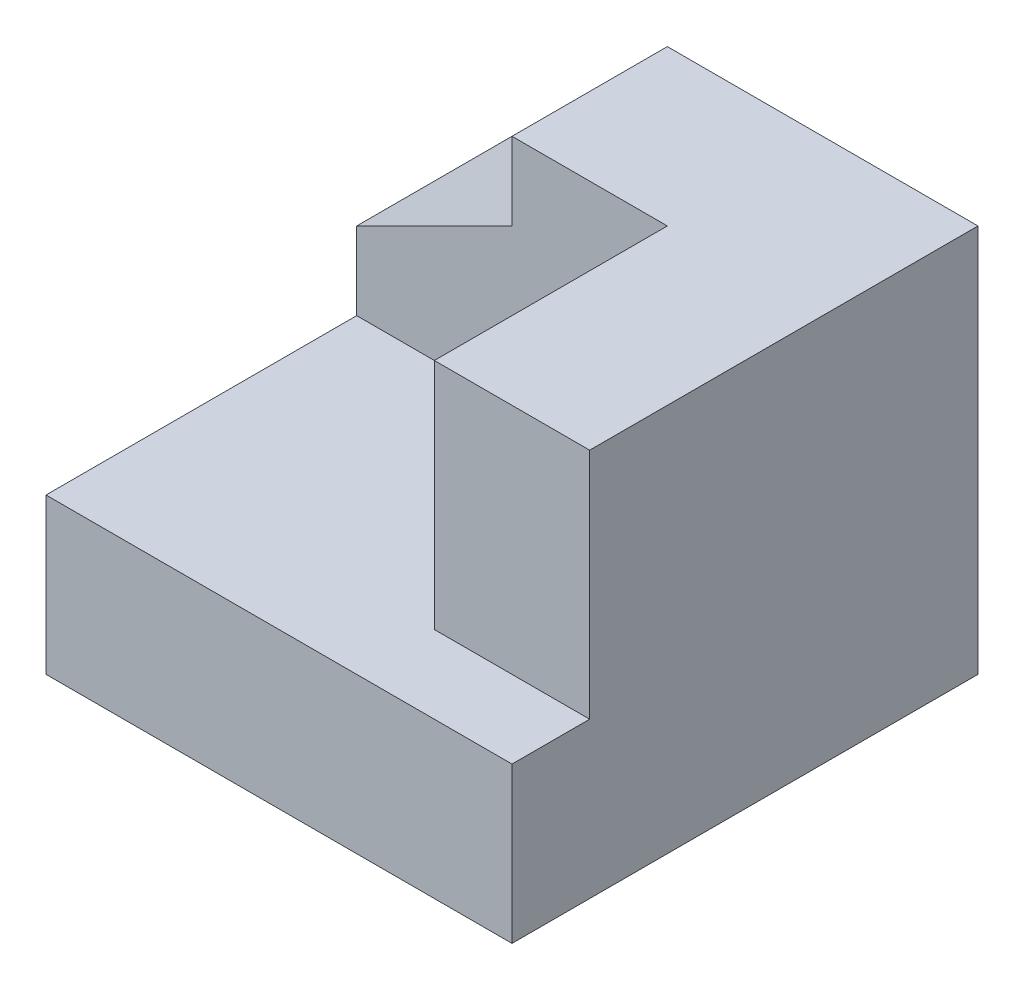
ISO-10303-21;
HEADER;
FILE_DESCRIPTION(('STEP AP214'),'2;1');
FILE_NAME('part.step','',(''),(''),'','','');
FILE_SCHEMA(('AUTOMOTIVE_DESIGN { 1 0 10303 214 1 1 1 1 }'));
ENDSEC;
DATA;
#1=APPLICATION_CONTEXT('core data for automotive mechanical design processes');
#2=APPLICATION_PROTOCOL_DEFINITION('international standard','automotive_design',2000,#1);
#3=PRODUCT_CONTEXT('',#1,'mechanical');
#4=PRODUCT('Part','Part','',(#3));
#5=PRODUCT_RELATED_PRODUCT_CATEGORY('part','',(#4));
#6=PRODUCT_DEFINITION_FORMATION('','',#4);
#7=PRODUCT_DEFINITION_CONTEXT('part definition',#1,'design');
#8=PRODUCT_DEFINITION('design','',#6,#7);
#9=PRODUCT_DEFINITION_SHAPE('','',#8);
#10=(LENGTH_UNIT() NAMED_UNIT(*) SI_UNIT(.MILLI.,.METRE.));
#11=(NAMED_UNIT(*) PLANE_ANGLE_UNIT() SI_UNIT($,.RADIAN.));
#12=(NAMED_UNIT(*) SI_UNIT($,.STERADIAN.) SOLID_ANGLE_UNIT());
#13=UNCERTAINTY_MEASURE_WITH_UNIT(LENGTH_MEASURE(1.E-05),#10,'distance_accuracy_value','');
#14=(GEOMETRIC_REPRESENTATION_CONTEXT(3) GLOBAL_UNCERTAINTY_ASSIGNED_CONTEXT((#13)) GLOBAL_UNIT_ASSIGNED_CONTEXT((#10,
#11,#12)) REPRESENTATION_CONTEXT('',''));
#15=CARTESIAN_POINT('',(0.,0.,0.));
#16=DIRECTION('',(0.,0.,1.));
#17=DIRECTION('',(1.,0.,0.));
#18=AXIS2_PLACEMENT_3D('',#15,#16,#17);
#19=CARTESIAN_POINT('',(0.,-100.,120.));
#20=DIRECTION('',(0.,1.,0.));
#21=DIRECTION('',(0.,0.,1.));
#22=AXIS2_PLACEMENT_3D('',#19,#20,#21);
#23=PLANE('',#22);
#24=DIRECTION('',(0.,0.,-1.));
#25=VECTOR('',#24,1.);
#26=CARTESIAN_POINT('',(-120.,-100.,120.));
#27=LINE('',#26,#25);
#28=CARTESIAN_POINT('',(-120.,-100.,120.));
#29=VERTEX_POINT('',#28);
#30=CARTESIAN_POINT('',(-120.,-100.,-120.));
#31=VERTEX_POINT('',#30);
#32=EDGE_CURVE('E205',#29,#31,#27,.T.);
#33=ORIENTED_EDGE('',*,*,#32,.T.);
#34=DIRECTION('',(1.,0.,0.));
#35=VECTOR('',#34,1.);
#36=CARTESIAN_POINT('',(0.,-100.,-120.));
#37=LINE('',#36,#35);
#38=CARTESIAN_POINT('',(120.,-100.,-120.));
#39=VERTEX_POINT('',#38);
#40=EDGE_CURVE('E141',#31,#39,#37,.T.);
#41=ORIENTED_EDGE('',*,*,#40,.T.);
#42=DIRECTION('',(0.,0.,-1.));
#43=VECTOR('',#42,1.);
#44=CARTESIAN_POINT('',(120.,-100.,120.));
#45=LINE('',#44,#43);
#46=CARTESIAN_POINT('',(120.,-100.,120.));
#47=VERTEX_POINT('',#46);
#48=EDGE_CURVE('E11',#47,#39,#45,.T.);
#49=ORIENTED_EDGE('',*,*,#48,.F.);
#50=DIRECTION('',(1.,0.,0.));
#51=VECTOR('',#50,1.);
#52=CARTESIAN_POINT('',(0.,-100.,120.));
#53=LINE('',#52,#51);
#54=EDGE_CURVE('E187',#29,#47,#53,.T.);
#55=ORIENTED_EDGE('',*,*,#54,.F.);
#56=EDGE_LOOP('',(#33,#41,#49,#55));
#57=FACE_BOUND('',#56,.T.);
#58=ADVANCED_FACE('F34',(#57),#23,.F.);
#59=CARTESIAN_POINT('',(120.,0.,120.));
#60=DIRECTION('',(-1.,0.,0.));
#61=DIRECTION('',(0.,0.,1.));
#62=AXIS2_PLACEMENT_3D('',#59,#60,#61);
#63=PLANE('',#62);
#64=ORIENTED_EDGE('',*,*,#48,.T.);
#65=DIRECTION('',(0.,1.,0.));
#66=VECTOR('',#65,1.);
#67=CARTESIAN_POINT('',(120.,0.,-120.));
#68=LINE('',#67,#66);
#69=CARTESIAN_POINT('',(120.,100.,-120.));
#70=VERTEX_POINT('',#69);
#71=EDGE_CURVE('E144',#39,#70,#68,.T.);
#72=ORIENTED_EDGE('',*,*,#71,.T.);
#73=DIRECTION('',(0.,0.,-1.));
#74=VECTOR('',#73,1.);
#75=CARTESIAN_POINT('',(120.,100.,80.));
#76=LINE('',#75,#74);
#77=CARTESIAN_POINT('',(120.,100.,80.));
#78=VERTEX_POINT('',#77);
#79=EDGE_CURVE('E155',#78,#70,#76,.T.);
#80=ORIENTED_EDGE('',*,*,#79,.F.);
#81=DIRECTION('',(0.,1.,0.));
#82=VECTOR('',#81,1.);
#83=CARTESIAN_POINT('',(120.,0.,80.));
#84=LINE('',#83,#82);
#85=CARTESIAN_POINT('',(120.,-20.,80.));
#86=VERTEX_POINT('',#85);
#87=EDGE_CURVE('E158',#86,#78,#84,.T.);
#88=ORIENTED_EDGE('',*,*,#87,.F.);
#89=DIRECTION('',(0.,0.,-1.));
#90=VECTOR('',#89,1.);
#91=CARTESIAN_POINT('',(120.,-20.,120.));
#92=LINE('',#91,#90);
#93=CARTESIAN_POINT('',(120.,-20.,120.));
#94=VERTEX_POINT('',#93);
#95=EDGE_CURVE('E42',#94,#86,#92,.T.);
#96=ORIENTED_EDGE('',*,*,#95,.F.);
#97=DIRECTION('',(0.,1.,0.));
#98=VECTOR('',#97,1.);
#99=CARTESIAN_POINT('',(120.,0.,120.));
#100=LINE('',#99,#98);
#101=EDGE_CURVE('E214',#47,#94,#100,.T.);
#102=ORIENTED_EDGE('',*,*,#101,.F.);
#103=EDGE_LOOP('',(#64,#72,#80,#88,#96,#102));
#104=FACE_BOUND('',#103,.T.);
#105=ADVANCED_FACE('F223',(#104),#63,.F.);
#106=CARTESIAN_POINT('',(0.,-20.,120.));
#107=DIRECTION('',(0.,-1.,0.));
#108=DIRECTION('',(1.,0.,0.));
#109=AXIS2_PLACEMENT_3D('',#106,#107,#108);
#110=PLANE('',#109);
#111=DIRECTION('',(0.,0.,-1.));
#112=VECTOR('',#111,1.);
#113=CARTESIAN_POINT('',(40.,-20.,80.));
#114=LINE('',#113,#112);
#115=CARTESIAN_POINT('',(40.,-20.,80.));
#116=VERTEX_POINT('',#115);
#117=CARTESIAN_POINT('',(40.,-20.,-40.));
#118=VERTEX_POINT('',#117);
#119=EDGE_CURVE('E157',#116,#118,#114,.T.);
#120=ORIENTED_EDGE('',*,*,#119,.T.);
#121=DIRECTION('',(1.,0.,0.));
#122=VECTOR('',#121,1.);
#123=CARTESIAN_POINT('',(-120.,-20.,-40.));
#124=LINE('',#123,#122);
#125=CARTESIAN_POINT('',(-120.,-20.,-40.));
#126=VERTEX_POINT('',#125);
#127=EDGE_CURVE('E130',#126,#118,#124,.T.);
#128=ORIENTED_EDGE('',*,*,#127,.F.);
#129=DIRECTION('',(0.,0.,-1.));
#130=VECTOR('',#129,1.);
#131=CARTESIAN_POINT('',(-120.,-20.,120.));
#132=LINE('',#131,#130);
#133=CARTESIAN_POINT('',(-120.,-20.,120.));
#134=VERTEX_POINT('',#133);
#135=EDGE_CURVE('E129',#134,#126,#132,.T.);
#136=ORIENTED_EDGE('',*,*,#135,.F.);
#137=DIRECTION('',(-1.,0.,0.));
#138=VECTOR('',#137,1.);
#139=CARTESIAN_POINT('',(0.,-20.,120.));
#140=LINE('',#139,#138);
#141=EDGE_CURVE('E216',#94,#134,#140,.T.);
#142=ORIENTED_EDGE('',*,*,#141,.F.);
#143=ORIENTED_EDGE('',*,*,#95,.T.);
#144=DIRECTION('',(-1.,0.,0.));
#145=VECTOR('',#144,1.);
#146=CARTESIAN_POINT('',(0.,-20.,80.));
#147=LINE('',#146,#145);
#148=EDGE_CURVE('E154',#86,#116,#147,.T.);
#149=ORIENTED_EDGE('',*,*,#148,.T.);
#150=EDGE_LOOP('',(#120,#128,#136,#142,#143,#149));
#151=FACE_BOUND('',#150,.T.);
#152=ADVANCED_FACE('F174',(#151),#110,.F.);
#153=CARTESIAN_POINT('',(-120.,0.,120.));
#154=DIRECTION('',(-1.,0.,0.));
#155=DIRECTION('',(0.,0.,1.));
#156=AXIS2_PLACEMENT_3D('',#153,#154,#155);
#157=PLANE('',#156);
#158=DIRECTION('',(0.,0.,-1.));
#159=VECTOR('',#158,1.);
#160=CARTESIAN_POINT('',(-120.,19.9999999999999,120.000025));
#161=LINE('',#160,#159);
#162=CARTESIAN_POINT('',(-120.,19.9999999999999,-39.9999999999999));
#163=VERTEX_POINT('',#162);
#164=CARTESIAN_POINT('',(-120.,19.9999999999999,-120.));
#165=VERTEX_POINT('',#164);
#166=EDGE_CURVE('E110',#163,#165,#161,.T.);
#167=ORIENTED_EDGE('',*,*,#166,.T.);
#168=DIRECTION('',(0.,1.,0.));
#169=VECTOR('',#168,1.);
#170=CARTESIAN_POINT('',(-120.,0.,-120.));
#171=LINE('',#170,#169);
#172=EDGE_CURVE('E147',#31,#165,#171,.T.);
#173=ORIENTED_EDGE('',*,*,#172,.F.);
#174=ORIENTED_EDGE('',*,*,#32,.F.);
#175=DIRECTION('',(0.,1.,0.));
#176=VECTOR('',#175,1.);
#177=CARTESIAN_POINT('',(-120.,0.,120.));
#178=LINE('',#177,#176);
#179=EDGE_CURVE('E208',#29,#134,#178,.T.);
#180=ORIENTED_EDGE('',*,*,#179,.T.);
#181=ORIENTED_EDGE('',*,*,#135,.T.);
#182=DIRECTION('',(0.,-1.,0.));
#183=VECTOR('',#182,1.);
#184=CARTESIAN_POINT('',(-120.,0.,-40.));
#185=LINE('',#184,#183);
#186=EDGE_CURVE('E56',#163,#126,#185,.T.);
#187=ORIENTED_EDGE('',*,*,#186,.F.);
#188=EDGE_LOOP('',(#167,#173,#174,#180,#181,#187));
#189=FACE_BOUND('',#188,.T.);
#190=ADVANCED_FACE('F126',(#189),#157,.T.);
#191=CARTESIAN_POINT('',(0.,0.,120.));
#192=DIRECTION('',(0.,0.,1.));
#193=DIRECTION('',(1.,0.,0.));
#194=AXIS2_PLACEMENT_3D('',#191,#192,#193);
#195=PLANE('',#194);
#196=ORIENTED_EDGE('',*,*,#54,.T.);
#197=ORIENTED_EDGE('',*,*,#101,.T.);
#198=ORIENTED_EDGE('',*,*,#141,.T.);
#199=ORIENTED_EDGE('',*,*,#179,.F.);
#200=EDGE_LOOP('',(#196,#197,#198,#199));
#201=FACE_BOUND('',#200,.T.);
#202=ADVANCED_FACE('F215',(#201),#195,.T.);
#203=CARTESIAN_POINT('',(0.,100.,80.));
#204=DIRECTION('',(0.,1.,0.));
#205=DIRECTION('',(0.,0.,1.));
#206=AXIS2_PLACEMENT_3D('',#203,#204,#205);
#207=PLANE('',#206);
#208=ORIENTED_EDGE('',*,*,#79,.T.);
#209=DIRECTION('',(1.,0.,0.));
#210=VECTOR('',#209,1.);
#211=CARTESIAN_POINT('',(0.,100.,-120.));
#212=LINE('',#211,#210);
#213=CARTESIAN_POINT('',(-40.,100.,-120.));
#214=VERTEX_POINT('',#213);
#215=EDGE_CURVE('E132',#214,#70,#212,.T.);
#216=ORIENTED_EDGE('',*,*,#215,.F.);
#217=DIRECTION('',(0.,0.,-1.));
#218=VECTOR('',#217,1.);
#219=CARTESIAN_POINT('',(-40.,100.,0.));
#220=LINE('',#219,#218);
#221=CARTESIAN_POINT('',(-40.,100.,-40.));
#222=VERTEX_POINT('',#221);
#223=EDGE_CURVE('E191',#222,#214,#220,.T.);
#224=ORIENTED_EDGE('',*,*,#223,.F.);
#225=DIRECTION('',(1.,0.,0.));
#226=VECTOR('',#225,1.);
#227=CARTESIAN_POINT('',(-40.,100.,-40.));
#228=LINE('',#227,#226);
#229=CARTESIAN_POINT('',(40.,100.,-40.));
#230=VERTEX_POINT('',#229);
#231=EDGE_CURVE('E134',#222,#230,#228,.T.);
#232=ORIENTED_EDGE('',*,*,#231,.T.);
#233=DIRECTION('',(0.,0.,-1.));
#234=VECTOR('',#233,1.);
#235=CARTESIAN_POINT('',(40.,100.,80.));
#236=LINE('',#235,#234);
#237=CARTESIAN_POINT('',(40.,100.,80.));
#238=VERTEX_POINT('',#237);
#239=EDGE_CURVE('E161',#238,#230,#236,.T.);
#240=ORIENTED_EDGE('',*,*,#239,.F.);
#241=DIRECTION('',(1.,0.,0.));
#242=VECTOR('',#241,1.);
#243=CARTESIAN_POINT('',(0.,100.,80.));
#244=LINE('',#243,#242);
#245=EDGE_CURVE('E149',#238,#78,#244,.T.);
#246=ORIENTED_EDGE('',*,*,#245,.T.);
#247=EDGE_LOOP('',(#208,#216,#224,#232,#240,#246));
#248=FACE_BOUND('',#247,.T.);
#249=ADVANCED_FACE('F189',(#248),#207,.T.);
#250=CARTESIAN_POINT('',(40.,0.,80.));
#251=DIRECTION('',(1.,0.,0.));
#252=DIRECTION('',(0.,1.,0.));
#253=AXIS2_PLACEMENT_3D('',#250,#251,#252);
#254=PLANE('',#253);
#255=ORIENTED_EDGE('',*,*,#239,.T.);
#256=DIRECTION('',(0.,-1.,0.));
#257=VECTOR('',#256,1.);
#258=CARTESIAN_POINT('',(40.,0.,-40.));
#259=LINE('',#258,#257);
#260=EDGE_CURVE('E50',#230,#118,#259,.T.);
#261=ORIENTED_EDGE('',*,*,#260,.T.);
#262=ORIENTED_EDGE('',*,*,#119,.F.);
#263=DIRECTION('',(0.,-1.,0.));
#264=VECTOR('',#263,1.);
#265=CARTESIAN_POINT('',(40.,0.,80.));
#266=LINE('',#265,#264);
#267=EDGE_CURVE('E152',#238,#116,#266,.T.);
#268=ORIENTED_EDGE('',*,*,#267,.F.);
#269=EDGE_LOOP('',(#255,#261,#262,#268));
#270=FACE_BOUND('',#269,.T.);
#271=ADVANCED_FACE('F184',(#270),#254,.F.);
#272=CARTESIAN_POINT('',(0.,0.,80.));
#273=DIRECTION('',(0.,0.,1.));
#274=DIRECTION('',(1.,0.,0.));
#275=AXIS2_PLACEMENT_3D('',#272,#273,#274);
#276=PLANE('',#275);
#277=ORIENTED_EDGE('',*,*,#245,.F.);
#278=ORIENTED_EDGE('',*,*,#267,.T.);
#279=ORIENTED_EDGE('',*,*,#148,.F.);
#280=ORIENTED_EDGE('',*,*,#87,.T.);
#281=EDGE_LOOP('',(#277,#278,#279,#280));
#282=FACE_BOUND('',#281,.T.);
#283=ADVANCED_FACE('F180',(#282),#276,.T.);
#284=CARTESIAN_POINT('',(0.,0.,-120.));
#285=DIRECTION('',(0.,0.,1.));
#286=DIRECTION('',(1.,0.,0.));
#287=AXIS2_PLACEMENT_3D('',#284,#285,#286);
#288=PLANE('',#287);
#289=ORIENTED_EDGE('',*,*,#172,.T.);
#290=DIRECTION('',(0.894427190999916,0.447213595499958,0.));
#291=VECTOR('',#290,1.);
#292=CARTESIAN_POINT('',(-32.,64.,-120.));
#293=LINE('',#292,#291);
#294=CARTESIAN_POINT('',(-40.,60.,-120.));
#295=VERTEX_POINT('',#294);
#296=EDGE_CURVE('E115',#165,#295,#293,.T.);
#297=ORIENTED_EDGE('',*,*,#296,.T.);
#298=DIRECTION('',(0.,-1.,0.));
#299=VECTOR('',#298,1.);
#300=CARTESIAN_POINT('',(-40.,0.,-120.));
#301=LINE('',#300,#299);
#302=EDGE_CURVE('E192',#214,#295,#301,.T.);
#303=ORIENTED_EDGE('',*,*,#302,.F.);
#304=ORIENTED_EDGE('',*,*,#215,.T.);
#305=ORIENTED_EDGE('',*,*,#71,.F.);
#306=ORIENTED_EDGE('',*,*,#40,.F.);
#307=EDGE_LOOP('',(#289,#297,#303,#304,#305,#306));
#308=FACE_BOUND('',#307,.T.);
#309=ADVANCED_FACE('F202',(#308),#288,.F.);
#310=CARTESIAN_POINT('',(-120.,0.,-40.));
#311=DIRECTION('',(0.,0.,1.));
#312=DIRECTION('',(0.,-1.,0.));
#313=AXIS2_PLACEMENT_3D('',#310,#311,#312);
#314=PLANE('',#313);
#315=DIRECTION('',(0.894427190999916,0.447213595499958,0.));
#316=VECTOR('',#315,1.);
#317=CARTESIAN_POINT('',(-128.,16.,-40.));
#318=LINE('',#317,#316);
#319=CARTESIAN_POINT('',(-40.,60.,-40.));
#320=VERTEX_POINT('',#319);
#321=EDGE_CURVE('E112',#163,#320,#318,.T.);
#322=ORIENTED_EDGE('',*,*,#321,.F.);
#323=ORIENTED_EDGE('',*,*,#186,.T.);
#324=ORIENTED_EDGE('',*,*,#127,.T.);
#325=ORIENTED_EDGE('',*,*,#260,.F.);
#326=ORIENTED_EDGE('',*,*,#231,.F.);
#327=DIRECTION('',(0.,-1.,0.));
#328=VECTOR('',#327,1.);
#329=CARTESIAN_POINT('',(-40.,0.,-40.));
#330=LINE('',#329,#328);
#331=EDGE_CURVE('E123',#222,#320,#330,.T.);
#332=ORIENTED_EDGE('',*,*,#331,.T.);
#333=EDGE_LOOP('',(#322,#323,#324,#325,#326,#332));
#334=FACE_BOUND('',#333,.T.);
#335=ADVANCED_FACE('F121',(#334),#314,.T.);
#336=CARTESIAN_POINT('',(-40.,0.,0.));
#337=DIRECTION('',(-1.,0.,0.));
#338=DIRECTION('',(0.,-1.,0.));
#339=AXIS2_PLACEMENT_3D('',#336,#337,#338);
#340=PLANE('',#339);
#341=DIRECTION('',(0.,0.,-1.));
#342=VECTOR('',#341,1.);
#343=CARTESIAN_POINT('',(-40.,60.,0.));
#344=LINE('',#343,#342);
#345=EDGE_CURVE('E199',#320,#295,#344,.T.);
#346=ORIENTED_EDGE('',*,*,#345,.F.);
#347=ORIENTED_EDGE('',*,*,#331,.F.);
#348=ORIENTED_EDGE('',*,*,#223,.T.);
#349=ORIENTED_EDGE('',*,*,#302,.T.);
#350=EDGE_LOOP('',(#346,#347,#348,#349));
#351=FACE_BOUND('',#350,.T.);
#352=ADVANCED_FACE('F224',(#351),#340,.T.);
#353=CARTESIAN_POINT('',(-32.,64.,120.000025));
#354=DIRECTION('',(0.447213595499958,-0.894427190999916,0.));
#355=DIRECTION('',(0.894427190999916,0.447213595499958,0.));
#356=AXIS2_PLACEMENT_3D('',#353,#354,#355);
#357=PLANE('',#356);
#358=ORIENTED_EDGE('',*,*,#166,.F.);
#359=ORIENTED_EDGE('',*,*,#321,.T.);
#360=ORIENTED_EDGE('',*,*,#345,.T.);
#361=ORIENTED_EDGE('',*,*,#296,.F.);
#362=EDGE_LOOP('',(#358,#359,#360,#361));
#363=FACE_BOUND('',#362,.T.);
#364=ADVANCED_FACE('F111',(#363),#357,.F.);
#365=CLOSED_SHELL('',(#58,#105,#152,#190,#202,#249,#271,#283,#309,#335,#352,#364));
#366=MANIFOLD_SOLID_BREP('B2',#365);
#367=ADVANCED_BREP_SHAPE_REPRESENTATION('',(#18,#366),#14);
#368=SHAPE_DEFINITION_REPRESENTATION(#9,#367);
ENDSEC;
END-ISO-10303-21;
